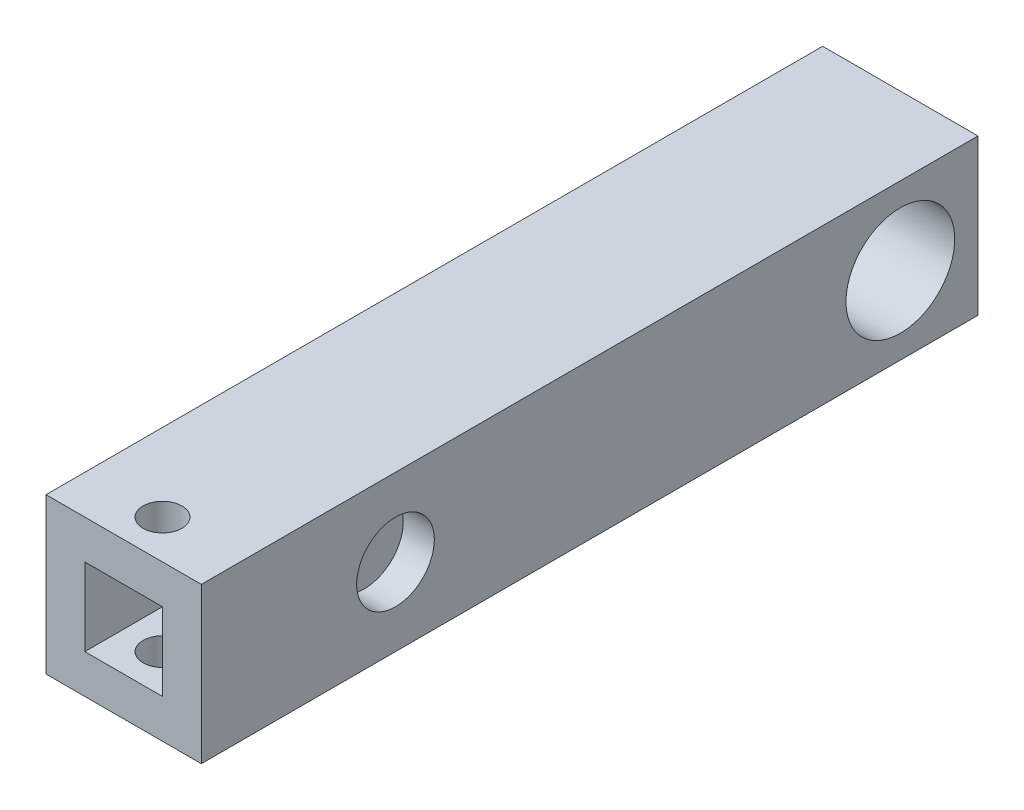
ISO-10303-21;
HEADER;
FILE_DESCRIPTION(('STEP AP214'),'2;1');
FILE_NAME('part.step','',(''),(''),'','','');
FILE_SCHEMA(('AUTOMOTIVE_DESIGN { 1 0 10303 214 1 1 1 1 }'));
ENDSEC;
DATA;
#1=APPLICATION_CONTEXT('core data for automotive mechanical design processes');
#2=APPLICATION_PROTOCOL_DEFINITION('international standard','automotive_design',2000,#1);
#3=PRODUCT_CONTEXT('',#1,'mechanical');
#4=PRODUCT('Part','Part','',(#3));
#5=PRODUCT_RELATED_PRODUCT_CATEGORY('part','',(#4));
#6=PRODUCT_DEFINITION_FORMATION('','',#4);
#7=PRODUCT_DEFINITION_CONTEXT('part definition',#1,'design');
#8=PRODUCT_DEFINITION('design','',#6,#7);
#9=PRODUCT_DEFINITION_SHAPE('','',#8);
#10=(LENGTH_UNIT() NAMED_UNIT(*) SI_UNIT(.MILLI.,.METRE.));
#11=(NAMED_UNIT(*) PLANE_ANGLE_UNIT() SI_UNIT($,.RADIAN.));
#12=(NAMED_UNIT(*) SI_UNIT($,.STERADIAN.) SOLID_ANGLE_UNIT());
#13=UNCERTAINTY_MEASURE_WITH_UNIT(LENGTH_MEASURE(1.E-05),#10,'distance_accuracy_value','');
#14=(GEOMETRIC_REPRESENTATION_CONTEXT(3) GLOBAL_UNCERTAINTY_ASSIGNED_CONTEXT((#13)) GLOBAL_UNIT_ASSIGNED_CONTEXT((#10,
#11,#12)) REPRESENTATION_CONTEXT('',''));
#15=CARTESIAN_POINT('',(0.,0.,0.));
#16=DIRECTION('',(0.,0.,1.));
#17=DIRECTION('',(1.,0.,0.));
#18=AXIS2_PLACEMENT_3D('',#15,#16,#17);
#19=CARTESIAN_POINT('',(100.,-100.,1000.));
#20=DIRECTION('',(-1.,0.,0.));
#21=DIRECTION('',(0.,0.,1.));
#22=AXIS2_PLACEMENT_3D('',#19,#20,#21);
#23=PLANE('',#22);
#24=CARTESIAN_POINT('',(100.,0.,750.));
#25=DIRECTION('',(1.,0.,0.));
#26=DIRECTION('',(0.,0.,-1.));
#27=AXIS2_PLACEMENT_3D('',#24,#25,#26);
#28=CIRCLE('',#27,50.);
#29=CARTESIAN_POINT('',(100.,0.,700.));
#30=VERTEX_POINT('',#29);
#31=EDGE_CURVE('E252',#30,#30,#28,.T.);
#32=ORIENTED_EDGE('',*,*,#31,.F.);
#33=EDGE_LOOP('',(#32));
#34=FACE_BOUND('',#33,.T.);
#35=CARTESIAN_POINT('',(100.,0.,100.));
#36=DIRECTION('',(-1.,0.,0.));
#37=DIRECTION('',(0.,0.,1.));
#38=AXIS2_PLACEMENT_3D('',#35,#36,#37);
#39=CIRCLE('',#38,70.);
#40=CARTESIAN_POINT('',(100.,0.,170.));
#41=VERTEX_POINT('',#40);
#42=EDGE_CURVE('E149',#41,#41,#39,.F.);
#43=ORIENTED_EDGE('',*,*,#42,.F.);
#44=EDGE_LOOP('',(#43));
#45=FACE_BOUND('',#44,.T.);
#46=DIRECTION('',(0.,1.,0.));
#47=VECTOR('',#46,1.);
#48=CARTESIAN_POINT('',(100.,-100.,0.));
#49=LINE('',#48,#47);
#50=CARTESIAN_POINT('',(100.,-100.,0.));
#51=VERTEX_POINT('',#50);
#52=CARTESIAN_POINT('',(100.,100.,0.));
#53=VERTEX_POINT('',#52);
#54=EDGE_CURVE('E152',#51,#53,#49,.T.);
#55=ORIENTED_EDGE('',*,*,#54,.T.);
#56=DIRECTION('',(0.,0.,-1.));
#57=VECTOR('',#56,1.);
#58=CARTESIAN_POINT('',(100.,100.,1000.));
#59=LINE('',#58,#57);
#60=CARTESIAN_POINT('',(100.,100.,1000.));
#61=VERTEX_POINT('',#60);
#62=EDGE_CURVE('E11',#61,#53,#59,.T.);
#63=ORIENTED_EDGE('',*,*,#62,.F.);
#64=DIRECTION('',(0.,1.,0.));
#65=VECTOR('',#64,1.);
#66=CARTESIAN_POINT('',(100.,-100.,1000.));
#67=LINE('',#66,#65);
#68=CARTESIAN_POINT('',(100.,-100.,1000.));
#69=VERTEX_POINT('',#68);
#70=EDGE_CURVE('E153',#69,#61,#67,.T.);
#71=ORIENTED_EDGE('',*,*,#70,.F.);
#72=DIRECTION('',(0.,0.,-1.));
#73=VECTOR('',#72,1.);
#74=CARTESIAN_POINT('',(100.,-100.,1000.));
#75=LINE('',#74,#73);
#76=EDGE_CURVE('E159',#69,#51,#75,.T.);
#77=ORIENTED_EDGE('',*,*,#76,.T.);
#78=EDGE_LOOP('',(#55,#63,#71,#77));
#79=FACE_BOUND('',#78,.T.);
#80=ADVANCED_FACE('F32',(#34,#45,#79),#23,.F.);
#81=CARTESIAN_POINT('',(-100.,100.,1000.));
#82=DIRECTION('',(0.,-1.,0.));
#83=DIRECTION('',(0.,0.,-1.));
#84=AXIS2_PLACEMENT_3D('',#81,#82,#83);
#85=PLANE('',#84);
#86=CARTESIAN_POINT('',(0.,100.,950.));
#87=DIRECTION('',(0.,-1.,0.));
#88=DIRECTION('',(0.,0.,-1.));
#89=AXIS2_PLACEMENT_3D('',#86,#87,#88);
#90=CIRCLE('',#89,25.);
#91=CARTESIAN_POINT('',(25.,100.,950.));
#92=VERTEX_POINT('',#91);
#93=EDGE_CURVE('E133',#92,#92,#90,.F.);
#94=ORIENTED_EDGE('',*,*,#93,.F.);
#95=EDGE_LOOP('',(#94));
#96=FACE_BOUND('',#95,.T.);
#97=DIRECTION('',(-1.,0.,0.));
#98=VECTOR('',#97,1.);
#99=CARTESIAN_POINT('',(-100.,100.,0.));
#100=LINE('',#99,#98);
#101=CARTESIAN_POINT('',(-100.,100.,0.));
#102=VERTEX_POINT('',#101);
#103=EDGE_CURVE('E162',#53,#102,#100,.T.);
#104=ORIENTED_EDGE('',*,*,#103,.T.);
#105=DIRECTION('',(0.,0.,-1.));
#106=VECTOR('',#105,1.);
#107=CARTESIAN_POINT('',(-100.,100.,1000.));
#108=LINE('',#107,#106);
#109=CARTESIAN_POINT('',(-100.,100.,1000.));
#110=VERTEX_POINT('',#109);
#111=EDGE_CURVE('E40',#110,#102,#108,.T.);
#112=ORIENTED_EDGE('',*,*,#111,.F.);
#113=DIRECTION('',(-1.,0.,0.));
#114=VECTOR('',#113,1.);
#115=CARTESIAN_POINT('',(-100.,100.,1000.));
#116=LINE('',#115,#114);
#117=EDGE_CURVE('E85',#61,#110,#116,.T.);
#118=ORIENTED_EDGE('',*,*,#117,.F.);
#119=ORIENTED_EDGE('',*,*,#62,.T.);
#120=EDGE_LOOP('',(#104,#112,#118,#119));
#121=FACE_BOUND('',#120,.T.);
#122=ADVANCED_FACE('F181',(#96,#121),#85,.F.);
#123=CARTESIAN_POINT('',(-100.,-100.,1000.));
#124=DIRECTION('',(1.,0.,0.));
#125=DIRECTION('',(0.,0.,-1.));
#126=AXIS2_PLACEMENT_3D('',#123,#124,#125);
#127=PLANE('',#126);
#128=CARTESIAN_POINT('',(-100.,0.,750.));
#129=DIRECTION('',(-1.,0.,0.));
#130=DIRECTION('',(0.,0.,1.));
#131=AXIS2_PLACEMENT_3D('',#128,#129,#130);
#132=CIRCLE('',#131,50.);
#133=CARTESIAN_POINT('',(-100.,0.,800.));
#134=VERTEX_POINT('',#133);
#135=EDGE_CURVE('E253',#134,#134,#132,.T.);
#136=ORIENTED_EDGE('',*,*,#135,.F.);
#137=EDGE_LOOP('',(#136));
#138=FACE_BOUND('',#137,.T.);
#139=CARTESIAN_POINT('',(-100.,0.,100.));
#140=DIRECTION('',(1.,0.,0.));
#141=DIRECTION('',(0.,0.,-1.));
#142=AXIS2_PLACEMENT_3D('',#139,#140,#141);
#143=CIRCLE('',#142,70.);
#144=CARTESIAN_POINT('',(-100.,0.,30.));
#145=VERTEX_POINT('',#144);
#146=EDGE_CURVE('E145',#145,#145,#143,.F.);
#147=ORIENTED_EDGE('',*,*,#146,.F.);
#148=EDGE_LOOP('',(#147));
#149=FACE_BOUND('',#148,.T.);
#150=DIRECTION('',(0.,-1.,0.));
#151=VECTOR('',#150,1.);
#152=CARTESIAN_POINT('',(-100.,-100.,0.));
#153=LINE('',#152,#151);
#154=CARTESIAN_POINT('',(-100.,-100.,0.));
#155=VERTEX_POINT('',#154);
#156=EDGE_CURVE('E164',#102,#155,#153,.T.);
#157=ORIENTED_EDGE('',*,*,#156,.T.);
#158=DIRECTION('',(0.,0.,-1.));
#159=VECTOR('',#158,1.);
#160=CARTESIAN_POINT('',(-100.,-100.,1000.));
#161=LINE('',#160,#159);
#162=CARTESIAN_POINT('',(-100.,-100.,1000.));
#163=VERTEX_POINT('',#162);
#164=EDGE_CURVE('E168',#163,#155,#161,.T.);
#165=ORIENTED_EDGE('',*,*,#164,.F.);
#166=DIRECTION('',(0.,-1.,0.));
#167=VECTOR('',#166,1.);
#168=CARTESIAN_POINT('',(-100.,-100.,1000.));
#169=LINE('',#168,#167);
#170=EDGE_CURVE('E156',#110,#163,#169,.T.);
#171=ORIENTED_EDGE('',*,*,#170,.F.);
#172=ORIENTED_EDGE('',*,*,#111,.T.);
#173=EDGE_LOOP('',(#157,#165,#171,#172));
#174=FACE_BOUND('',#173,.T.);
#175=ADVANCED_FACE('F177',(#138,#149,#174),#127,.F.);
#176=CARTESIAN_POINT('',(-100.,-100.,1000.));
#177=DIRECTION('',(0.,1.,0.));
#178=DIRECTION('',(0.,0.,1.));
#179=AXIS2_PLACEMENT_3D('',#176,#177,#178);
#180=PLANE('',#179);
#181=CARTESIAN_POINT('',(0.,-100.,950.));
#182=DIRECTION('',(0.,1.,0.));
#183=DIRECTION('',(0.,0.,1.));
#184=AXIS2_PLACEMENT_3D('',#181,#182,#183);
#185=CIRCLE('',#184,25.);
#186=CARTESIAN_POINT('',(25.,-100.,950.));
#187=VERTEX_POINT('',#186);
#188=EDGE_CURVE('E265',#187,#187,#185,.F.);
#189=ORIENTED_EDGE('',*,*,#188,.F.);
#190=EDGE_LOOP('',(#189));
#191=FACE_BOUND('',#190,.T.);
#192=DIRECTION('',(1.,0.,0.));
#193=VECTOR('',#192,1.);
#194=CARTESIAN_POINT('',(-100.,-100.,0.));
#195=LINE('',#194,#193);
#196=EDGE_CURVE('E78',#155,#51,#195,.T.);
#197=ORIENTED_EDGE('',*,*,#196,.T.);
#198=ORIENTED_EDGE('',*,*,#76,.F.);
#199=DIRECTION('',(1.,0.,0.));
#200=VECTOR('',#199,1.);
#201=CARTESIAN_POINT('',(-100.,-100.,1000.));
#202=LINE('',#201,#200);
#203=EDGE_CURVE('E57',#163,#69,#202,.T.);
#204=ORIENTED_EDGE('',*,*,#203,.F.);
#205=ORIENTED_EDGE('',*,*,#164,.T.);
#206=EDGE_LOOP('',(#197,#198,#204,#205));
#207=FACE_BOUND('',#206,.T.);
#208=ADVANCED_FACE('F180',(#191,#207),#180,.F.);
#209=CARTESIAN_POINT('',(0.,0.,1000.));
#210=DIRECTION('',(0.,0.,-1.));
#211=DIRECTION('',(-1.,0.,0.));
#212=AXIS2_PLACEMENT_3D('',#209,#210,#211);
#213=PLANE('',#212);
#214=DIRECTION('',(1.,0.,0.));
#215=VECTOR('',#214,1.);
#216=CARTESIAN_POINT('',(50.,-50.,1000.));
#217=LINE('',#216,#215);
#218=CARTESIAN_POINT('',(-50.,-50.,1000.));
#219=VERTEX_POINT('',#218);
#220=CARTESIAN_POINT('',(50.,-50.,1000.));
#221=VERTEX_POINT('',#220);
#222=EDGE_CURVE('E139',#219,#221,#217,.T.);
#223=ORIENTED_EDGE('',*,*,#222,.F.);
#224=DIRECTION('',(0.,-1.,0.));
#225=VECTOR('',#224,1.);
#226=CARTESIAN_POINT('',(-50.,50.,1000.));
#227=LINE('',#226,#225);
#228=CARTESIAN_POINT('',(-50.,50.,1000.));
#229=VERTEX_POINT('',#228);
#230=EDGE_CURVE('E48',#229,#219,#227,.T.);
#231=ORIENTED_EDGE('',*,*,#230,.F.);
#232=DIRECTION('',(-1.,0.,0.));
#233=VECTOR('',#232,1.);
#234=CARTESIAN_POINT('',(50.,50.,1000.));
#235=LINE('',#234,#233);
#236=CARTESIAN_POINT('',(50.,50.,1000.));
#237=VERTEX_POINT('',#236);
#238=EDGE_CURVE('E127',#237,#229,#235,.T.);
#239=ORIENTED_EDGE('',*,*,#238,.F.);
#240=DIRECTION('',(0.,1.,0.));
#241=VECTOR('',#240,1.);
#242=CARTESIAN_POINT('',(50.,50.,1000.));
#243=LINE('',#242,#241);
#244=EDGE_CURVE('E130',#221,#237,#243,.T.);
#245=ORIENTED_EDGE('',*,*,#244,.F.);
#246=EDGE_LOOP('',(#223,#231,#239,#245));
#247=FACE_BOUND('',#246,.T.);
#248=ORIENTED_EDGE('',*,*,#70,.T.);
#249=ORIENTED_EDGE('',*,*,#117,.T.);
#250=ORIENTED_EDGE('',*,*,#170,.T.);
#251=ORIENTED_EDGE('',*,*,#203,.T.);
#252=EDGE_LOOP('',(#248,#249,#250,#251));
#253=FACE_BOUND('',#252,.T.);
#254=ADVANCED_FACE('F193',(#247,#253),#213,.F.);
#255=CARTESIAN_POINT('',(0.,0.,0.));
#256=DIRECTION('',(0.,0.,-1.));
#257=DIRECTION('',(-1.,0.,0.));
#258=AXIS2_PLACEMENT_3D('',#255,#256,#257);
#259=PLANE('',#258);
#260=ORIENTED_EDGE('',*,*,#54,.F.);
#261=ORIENTED_EDGE('',*,*,#196,.F.);
#262=ORIENTED_EDGE('',*,*,#156,.F.);
#263=ORIENTED_EDGE('',*,*,#103,.F.);
#264=EDGE_LOOP('',(#260,#261,#262,#263));
#265=FACE_BOUND('',#264,.T.);
#266=ADVANCED_FACE('F189',(#265),#259,.T.);
#267=CARTESIAN_POINT('',(200.,0.,100.));
#268=DIRECTION('',(-1.,0.,0.));
#269=DIRECTION('',(0.,0.,1.));
#270=AXIS2_PLACEMENT_3D('',#267,#268,#269);
#271=CYLINDRICAL_SURFACE('',#270,70.);
#272=ORIENTED_EDGE('',*,*,#146,.T.);
#273=EDGE_LOOP('',(#272));
#274=FACE_BOUND('',#273,.T.);
#275=ORIENTED_EDGE('',*,*,#42,.T.);
#276=EDGE_LOOP('',(#275));
#277=FACE_BOUND('',#276,.T.);
#278=ADVANCED_FACE('F174',(#274,#277),#271,.F.);
#279=CARTESIAN_POINT('',(-50.,50.,900.));
#280=DIRECTION('',(-1.,0.,0.));
#281=DIRECTION('',(0.,-1.,0.));
#282=AXIS2_PLACEMENT_3D('',#279,#280,#281);
#283=PLANE('',#282);
#284=ORIENTED_EDGE('',*,*,#230,.T.);
#285=DIRECTION('',(0.,0.,1.));
#286=VECTOR('',#285,1.);
#287=CARTESIAN_POINT('',(-50.,-50.,900.));
#288=LINE('',#287,#286);
#289=CARTESIAN_POINT('',(-50.,-50.,900.));
#290=VERTEX_POINT('',#289);
#291=EDGE_CURVE('E105',#290,#219,#288,.T.);
#292=ORIENTED_EDGE('',*,*,#291,.F.);
#293=DIRECTION('',(0.,-1.,0.));
#294=VECTOR('',#293,1.);
#295=CARTESIAN_POINT('',(-50.,50.,900.));
#296=LINE('',#295,#294);
#297=CARTESIAN_POINT('',(-50.,50.,900.));
#298=VERTEX_POINT('',#297);
#299=EDGE_CURVE('E109',#298,#290,#296,.T.);
#300=ORIENTED_EDGE('',*,*,#299,.F.);
#301=DIRECTION('',(0.,0.,1.));
#302=VECTOR('',#301,1.);
#303=CARTESIAN_POINT('',(-50.,50.,900.));
#304=LINE('',#303,#302);
#305=EDGE_CURVE('E143',#298,#229,#304,.T.);
#306=ORIENTED_EDGE('',*,*,#305,.T.);
#307=EDGE_LOOP('',(#284,#292,#300,#306));
#308=FACE_BOUND('',#307,.T.);
#309=ADVANCED_FACE('F107',(#308),#283,.F.);
#310=CARTESIAN_POINT('',(50.,50.,900.));
#311=DIRECTION('',(0.,1.,0.));
#312=DIRECTION('',(-1.,0.,0.));
#313=AXIS2_PLACEMENT_3D('',#310,#311,#312);
#314=PLANE('',#313);
#315=CARTESIAN_POINT('',(0.,50.,950.));
#316=DIRECTION('',(0.,1.,0.));
#317=DIRECTION('',(-1.,0.,0.));
#318=AXIS2_PLACEMENT_3D('',#315,#316,#317);
#319=CIRCLE('',#318,25.);
#320=CARTESIAN_POINT('',(25.,50.,950.));
#321=VERTEX_POINT('',#320);
#322=EDGE_CURVE('E263',#321,#321,#319,.F.);
#323=ORIENTED_EDGE('',*,*,#322,.F.);
#324=EDGE_LOOP('',(#323));
#325=FACE_BOUND('',#324,.T.);
#326=ORIENTED_EDGE('',*,*,#238,.T.);
#327=ORIENTED_EDGE('',*,*,#305,.F.);
#328=DIRECTION('',(-1.,0.,0.));
#329=VECTOR('',#328,1.);
#330=CARTESIAN_POINT('',(50.,50.,900.));
#331=LINE('',#330,#329);
#332=CARTESIAN_POINT('',(50.,50.,900.));
#333=VERTEX_POINT('',#332);
#334=EDGE_CURVE('E115',#333,#298,#331,.T.);
#335=ORIENTED_EDGE('',*,*,#334,.F.);
#336=DIRECTION('',(0.,0.,1.));
#337=VECTOR('',#336,1.);
#338=CARTESIAN_POINT('',(50.,50.,900.));
#339=LINE('',#338,#337);
#340=EDGE_CURVE('E146',#333,#237,#339,.T.);
#341=ORIENTED_EDGE('',*,*,#340,.T.);
#342=EDGE_LOOP('',(#326,#327,#335,#341));
#343=FACE_BOUND('',#342,.T.);
#344=ADVANCED_FACE('F214',(#325,#343),#314,.F.);
#345=CARTESIAN_POINT('',(50.,50.,900.));
#346=DIRECTION('',(1.,0.,0.));
#347=DIRECTION('',(0.,1.,0.));
#348=AXIS2_PLACEMENT_3D('',#345,#346,#347);
#349=PLANE('',#348);
#350=ORIENTED_EDGE('',*,*,#244,.T.);
#351=ORIENTED_EDGE('',*,*,#340,.F.);
#352=DIRECTION('',(0.,1.,0.));
#353=VECTOR('',#352,1.);
#354=CARTESIAN_POINT('',(50.,50.,900.));
#355=LINE('',#354,#353);
#356=CARTESIAN_POINT('',(50.,-50.,900.));
#357=VERTEX_POINT('',#356);
#358=EDGE_CURVE('E123',#357,#333,#355,.T.);
#359=ORIENTED_EDGE('',*,*,#358,.F.);
#360=DIRECTION('',(0.,0.,1.));
#361=VECTOR('',#360,1.);
#362=CARTESIAN_POINT('',(50.,-50.,900.));
#363=LINE('',#362,#361);
#364=EDGE_CURVE('E114',#357,#221,#363,.T.);
#365=ORIENTED_EDGE('',*,*,#364,.T.);
#366=EDGE_LOOP('',(#350,#351,#359,#365));
#367=FACE_BOUND('',#366,.T.);
#368=ADVANCED_FACE('F217',(#367),#349,.F.);
#369=CARTESIAN_POINT('',(50.,-50.,900.));
#370=DIRECTION('',(0.,-1.,0.));
#371=DIRECTION('',(1.,0.,0.));
#372=AXIS2_PLACEMENT_3D('',#369,#370,#371);
#373=PLANE('',#372);
#374=CARTESIAN_POINT('',(0.,-50.,950.));
#375=DIRECTION('',(0.,-1.,0.));
#376=DIRECTION('',(1.,0.,0.));
#377=AXIS2_PLACEMENT_3D('',#374,#375,#376);
#378=CIRCLE('',#377,25.);
#379=CARTESIAN_POINT('',(25.,-50.,950.));
#380=VERTEX_POINT('',#379);
#381=EDGE_CURVE('E35',#380,#380,#378,.F.);
#382=ORIENTED_EDGE('',*,*,#381,.F.);
#383=EDGE_LOOP('',(#382));
#384=FACE_BOUND('',#383,.T.);
#385=ORIENTED_EDGE('',*,*,#222,.T.);
#386=ORIENTED_EDGE('',*,*,#364,.F.);
#387=DIRECTION('',(1.,0.,0.));
#388=VECTOR('',#387,1.);
#389=CARTESIAN_POINT('',(50.,-50.,900.));
#390=LINE('',#389,#388);
#391=EDGE_CURVE('E118',#290,#357,#390,.T.);
#392=ORIENTED_EDGE('',*,*,#391,.F.);
#393=ORIENTED_EDGE('',*,*,#291,.T.);
#394=EDGE_LOOP('',(#385,#386,#392,#393));
#395=FACE_BOUND('',#394,.T.);
#396=ADVANCED_FACE('F119',(#384,#395),#373,.F.);
#397=CARTESIAN_POINT('',(0.,0.,900.));
#398=DIRECTION('',(0.,0.,-1.));
#399=DIRECTION('',(-1.,0.,0.));
#400=AXIS2_PLACEMENT_3D('',#397,#398,#399);
#401=PLANE('',#400);
#402=ORIENTED_EDGE('',*,*,#299,.T.);
#403=ORIENTED_EDGE('',*,*,#391,.T.);
#404=ORIENTED_EDGE('',*,*,#358,.T.);
#405=ORIENTED_EDGE('',*,*,#334,.T.);
#406=EDGE_LOOP('',(#402,#403,#404,#405));
#407=FACE_BOUND('',#406,.T.);
#408=ADVANCED_FACE('F125',(#407),#401,.F.);
#409=CARTESIAN_POINT('',(0.,133.,950.));
#410=DIRECTION('',(0.,-1.,0.));
#411=DIRECTION('',(1.,0.,0.));
#412=AXIS2_PLACEMENT_3D('',#409,#410,#411);
#413=CYLINDRICAL_SURFACE('',#412,25.);
#414=CARTESIAN_POINT('',(25.,-50.,950.));
#415=CARTESIAN_POINT('',(25.,-50.5208333333333,950.));
#416=CARTESIAN_POINT('',(25.,-51.0416666666667,950.));
#417=CARTESIAN_POINT('',(25.,-52.0833333333333,950.));
#418=CARTESIAN_POINT('',(25.,-52.6041666666666,950.));
#419=CARTESIAN_POINT('',(25.,-53.6458333333333,950.));
#420=CARTESIAN_POINT('',(25.,-54.1666666666667,950.));
#421=CARTESIAN_POINT('',(25.,-55.2083333333333,950.));
#422=CARTESIAN_POINT('',(25.,-55.7291666666667,950.));
#423=CARTESIAN_POINT('',(25.,-56.7708333333333,950.));
#424=CARTESIAN_POINT('',(25.,-57.2916666666667,950.));
#425=CARTESIAN_POINT('',(25.,-58.3333333333333,950.));
#426=CARTESIAN_POINT('',(25.,-58.8541666666667,950.));
#427=CARTESIAN_POINT('',(25.,-59.8958333333333,950.));
#428=CARTESIAN_POINT('',(25.,-60.4166666666666,950.));
#429=CARTESIAN_POINT('',(25.,-61.4583333333333,950.));
#430=CARTESIAN_POINT('',(25.,-61.9791666666667,950.));
#431=CARTESIAN_POINT('',(25.,-63.0208333333333,950.));
#432=CARTESIAN_POINT('',(25.,-63.5416666666667,950.));
#433=CARTESIAN_POINT('',(25.,-64.5833333333333,950.));
#434=CARTESIAN_POINT('',(25.,-65.1041666666667,950.));
#435=CARTESIAN_POINT('',(25.,-66.1458333333333,950.));
#436=CARTESIAN_POINT('',(25.,-66.6666666666667,950.));
#437=CARTESIAN_POINT('',(25.,-67.7083333333333,950.));
#438=CARTESIAN_POINT('',(25.,-68.2291666666666,950.));
#439=CARTESIAN_POINT('',(25.,-69.2708333333333,950.));
#440=CARTESIAN_POINT('',(25.,-69.7916666666667,950.));
#441=CARTESIAN_POINT('',(25.,-70.8333333333333,950.));
#442=CARTESIAN_POINT('',(25.,-71.3541666666667,950.));
#443=CARTESIAN_POINT('',(25.,-72.3958333333333,950.));
#444=CARTESIAN_POINT('',(25.,-72.9166666666667,950.));
#445=CARTESIAN_POINT('',(25.,-73.9583333333333,950.));
#446=CARTESIAN_POINT('',(25.,-74.4791666666667,950.));
#447=CARTESIAN_POINT('',(25.,-75.5208333333333,950.));
#448=CARTESIAN_POINT('',(25.,-76.0416666666666,950.));
#449=CARTESIAN_POINT('',(25.,-77.0833333333333,950.));
#450=CARTESIAN_POINT('',(25.,-77.6041666666666,950.));
#451=CARTESIAN_POINT('',(25.,-78.6458333333333,950.));
#452=CARTESIAN_POINT('',(25.,-79.1666666666666,950.));
#453=CARTESIAN_POINT('',(25.,-80.2083333333333,950.));
#454=CARTESIAN_POINT('',(25.,-80.7291666666666,950.));
#455=CARTESIAN_POINT('',(25.,-81.7708333333333,950.));
#456=CARTESIAN_POINT('',(25.,-82.2916666666667,950.));
#457=CARTESIAN_POINT('',(25.,-83.3333333333333,950.));
#458=CARTESIAN_POINT('',(25.,-83.8541666666666,950.));
#459=CARTESIAN_POINT('',(25.,-84.8958333333333,950.));
#460=CARTESIAN_POINT('',(25.,-85.4166666666666,950.));
#461=CARTESIAN_POINT('',(25.,-86.4583333333333,950.));
#462=CARTESIAN_POINT('',(25.,-86.9791666666666,950.));
#463=CARTESIAN_POINT('',(25.,-88.0208333333333,950.));
#464=CARTESIAN_POINT('',(25.,-88.5416666666666,950.));
#465=CARTESIAN_POINT('',(25.,-89.5833333333333,950.));
#466=CARTESIAN_POINT('',(25.,-90.1041666666667,950.));
#467=CARTESIAN_POINT('',(25.,-91.1458333333333,950.));
#468=CARTESIAN_POINT('',(25.,-91.6666666666666,950.));
#469=CARTESIAN_POINT('',(25.,-92.7083333333333,950.));
#470=CARTESIAN_POINT('',(25.,-93.2291666666666,950.));
#471=CARTESIAN_POINT('',(25.,-94.2708333333333,950.));
#472=CARTESIAN_POINT('',(25.,-94.7916666666666,950.));
#473=CARTESIAN_POINT('',(25.,-95.8333333333333,950.));
#474=CARTESIAN_POINT('',(25.,-96.3541666666666,950.));
#475=CARTESIAN_POINT('',(25.,-97.3958333333333,950.));
#476=CARTESIAN_POINT('',(25.,-97.9166666666667,950.));
#477=CARTESIAN_POINT('',(25.,-98.9583333333333,950.));
#478=CARTESIAN_POINT('',(25.,-99.4791666666666,950.));
#479=CARTESIAN_POINT('',(25.,-100.,950.));
#480=B_SPLINE_CURVE_WITH_KNOTS('',3,(#414,#415,#416,#417,#418,#419,#420,#421,#422,#423,#424,
#425,#426,#427,#428,#429,#430,#431,#432,#433,#434,#435,#436,#437,#438,#439,#440,#441,#442,#443,
#444,#445,#446,#447,#448,#449,#450,#451,#452,#453,#454,#455,#456,#457,#458,#459,#460,#461,#462,
#463,#464,#465,#466,#467,#468,#469,#470,#471,#472,#473,#474,#475,#476,#477,#478,#479),
.UNSPECIFIED.,.F.,.F.,(4,2,2,2,2,2,2,2,2,2,2,2,2,2,2,2,2,2,2,2,2,2,2,2,2,2,2,2,2,2,2,2,4),(0.,
1.56249999999999,3.12499999999999,4.68750000000001,6.25000000000001,7.8125,9.37499999999999,
10.9375,12.5,14.0625,15.625,17.1875,18.75,20.3125,21.875,23.4375,25.,26.5625,28.125,29.6875,
31.25,32.8125,34.375,35.9375,37.5,39.0625,40.625,42.1875,43.75,45.3125,46.875,48.4375,50.),.UNSPECIFIED.);
#481=EDGE_CURVE('BSEAM227',#380,#187,#480,.T.);
#482=ORIENTED_EDGE('',*,*,#381,.T.);
#483=ORIENTED_EDGE('',*,*,#188,.T.);
#484=ORIENTED_EDGE('',*,*,#481,.T.);
#485=ORIENTED_EDGE('',*,*,#481,.F.);
#486=EDGE_LOOP('',(#482,#484,#483,#485));
#487=FACE_BOUND('',#486,.T.);
#488=ADVANCED_FACE('F227',(#487),#413,.F.);
#489=CARTESIAN_POINT('',(25.,50.,950.));
#490=CARTESIAN_POINT('',(25.,50.5208333333333,950.));
#491=CARTESIAN_POINT('',(25.,51.0416666666667,950.));
#492=CARTESIAN_POINT('',(25.,52.0833333333333,950.));
#493=CARTESIAN_POINT('',(25.,52.6041666666667,950.));
#494=CARTESIAN_POINT('',(25.,53.6458333333333,950.));
#495=CARTESIAN_POINT('',(25.,54.1666666666667,950.));
#496=CARTESIAN_POINT('',(25.,55.2083333333333,950.));
#497=CARTESIAN_POINT('',(25.,55.7291666666667,950.));
#498=CARTESIAN_POINT('',(25.,56.7708333333333,950.));
#499=CARTESIAN_POINT('',(25.,57.2916666666667,950.));
#500=CARTESIAN_POINT('',(25.,58.3333333333333,950.));
#501=CARTESIAN_POINT('',(25.,58.8541666666667,950.));
#502=CARTESIAN_POINT('',(25.,59.8958333333333,950.));
#503=CARTESIAN_POINT('',(25.,60.4166666666667,950.));
#504=CARTESIAN_POINT('',(25.,61.4583333333333,950.));
#505=CARTESIAN_POINT('',(25.,61.9791666666667,950.));
#506=CARTESIAN_POINT('',(25.,63.0208333333333,950.));
#507=CARTESIAN_POINT('',(25.,63.5416666666667,950.));
#508=CARTESIAN_POINT('',(25.,64.5833333333333,950.));
#509=CARTESIAN_POINT('',(25.,65.1041666666667,950.));
#510=CARTESIAN_POINT('',(25.,66.1458333333333,950.));
#511=CARTESIAN_POINT('',(25.,66.6666666666667,950.));
#512=CARTESIAN_POINT('',(25.,67.7083333333333,950.));
#513=CARTESIAN_POINT('',(25.,68.2291666666667,950.));
#514=CARTESIAN_POINT('',(25.,69.2708333333333,950.));
#515=CARTESIAN_POINT('',(25.,69.7916666666667,950.));
#516=CARTESIAN_POINT('',(25.,70.8333333333333,950.));
#517=CARTESIAN_POINT('',(25.,71.3541666666667,950.));
#518=CARTESIAN_POINT('',(25.,72.3958333333333,950.));
#519=CARTESIAN_POINT('',(25.,72.9166666666667,950.));
#520=CARTESIAN_POINT('',(25.,73.9583333333333,950.));
#521=CARTESIAN_POINT('',(25.,74.4791666666667,950.));
#522=CARTESIAN_POINT('',(25.,75.5208333333333,950.));
#523=CARTESIAN_POINT('',(25.,76.0416666666667,950.));
#524=CARTESIAN_POINT('',(25.,77.0833333333333,950.));
#525=CARTESIAN_POINT('',(25.,77.6041666666667,950.));
#526=CARTESIAN_POINT('',(25.,78.6458333333333,950.));
#527=CARTESIAN_POINT('',(25.,79.1666666666667,950.));
#528=CARTESIAN_POINT('',(25.,80.2083333333333,950.));
#529=CARTESIAN_POINT('',(25.,80.7291666666667,950.));
#530=CARTESIAN_POINT('',(25.,81.7708333333333,950.));
#531=CARTESIAN_POINT('',(25.,82.2916666666667,950.));
#532=CARTESIAN_POINT('',(25.,83.3333333333333,950.));
#533=CARTESIAN_POINT('',(25.,83.8541666666667,950.));
#534=CARTESIAN_POINT('',(25.,84.8958333333333,950.));
#535=CARTESIAN_POINT('',(25.,85.4166666666667,950.));
#536=CARTESIAN_POINT('',(25.,86.4583333333333,950.));
#537=CARTESIAN_POINT('',(25.,86.9791666666667,950.));
#538=CARTESIAN_POINT('',(25.,88.0208333333333,950.));
#539=CARTESIAN_POINT('',(25.,88.5416666666667,950.));
#540=CARTESIAN_POINT('',(25.,89.5833333333333,950.));
#541=CARTESIAN_POINT('',(25.,90.1041666666667,950.));
#542=CARTESIAN_POINT('',(25.,91.1458333333333,950.));
#543=CARTESIAN_POINT('',(25.,91.6666666666667,950.));
#544=CARTESIAN_POINT('',(25.,92.7083333333333,950.));
#545=CARTESIAN_POINT('',(25.,93.2291666666667,950.));
#546=CARTESIAN_POINT('',(25.,94.2708333333333,950.));
#547=CARTESIAN_POINT('',(25.,94.7916666666667,950.));
#548=CARTESIAN_POINT('',(25.,95.8333333333333,950.));
#549=CARTESIAN_POINT('',(25.,96.3541666666667,950.));
#550=CARTESIAN_POINT('',(25.,97.3958333333333,950.));
#551=CARTESIAN_POINT('',(25.,97.9166666666667,950.));
#552=CARTESIAN_POINT('',(25.,98.9583333333333,950.));
#553=CARTESIAN_POINT('',(25.,99.4791666666667,950.));
#554=CARTESIAN_POINT('',(25.,100.,950.));
#555=B_SPLINE_CURVE_WITH_KNOTS('',3,(#489,#490,#491,#492,#493,#494,#495,#496,#497,#498,#499,
#500,#501,#502,#503,#504,#505,#506,#507,#508,#509,#510,#511,#512,#513,#514,#515,#516,#517,#518,
#519,#520,#521,#522,#523,#524,#525,#526,#527,#528,#529,#530,#531,#532,#533,#534,#535,#536,#537,
#538,#539,#540,#541,#542,#543,#544,#545,#546,#547,#548,#549,#550,#551,#552,#553,#554),
.UNSPECIFIED.,.F.,.F.,(4,2,2,2,2,2,2,2,2,2,2,2,2,2,2,2,2,2,2,2,2,2,2,2,2,2,2,2,2,2,2,2,4),(0.,
1.56249999999999,3.125,4.6875,6.25000000000001,7.8125,9.37500000000001,10.9375,12.5,14.0625,
15.625,17.1875,18.75,20.3125,21.875,23.4375,25.,26.5625,28.125,29.6875,31.25,32.8125,34.375,
35.9375,37.5,39.0625,40.625,42.1875,43.75,45.3125,46.875,48.4375,50.),.UNSPECIFIED.);
#556=EDGE_CURVE('BSEAM228',#321,#92,#555,.T.);
#557=ORIENTED_EDGE('',*,*,#322,.T.);
#558=ORIENTED_EDGE('',*,*,#93,.T.);
#559=ORIENTED_EDGE('',*,*,#556,.T.);
#560=ORIENTED_EDGE('',*,*,#556,.F.);
#561=EDGE_LOOP('',(#557,#559,#558,#560));
#562=FACE_BOUND('',#561,.T.);
#563=ADVANCED_FACE('F228',(#562),#413,.F.);
#564=CARTESIAN_POINT('',(60.,0.,750.));
#565=DIRECTION('',(1.,0.,0.));
#566=DIRECTION('',(0.,0.,-1.));
#567=AXIS2_PLACEMENT_3D('',#564,#565,#566);
#568=CYLINDRICAL_SURFACE('',#567,50.);
#569=CARTESIAN_POINT('',(60.,0.,750.));
#570=DIRECTION('',(1.,0.,0.));
#571=DIRECTION('',(0.,0.,-1.));
#572=AXIS2_PLACEMENT_3D('',#569,#570,#571);
#573=CIRCLE('',#572,50.);
#574=CARTESIAN_POINT('',(60.,0.,700.));
#575=VERTEX_POINT('',#574);
#576=EDGE_CURVE('E256',#575,#575,#573,.T.);
#577=ORIENTED_EDGE('',*,*,#576,.F.);
#578=EDGE_LOOP('',(#577));
#579=FACE_BOUND('',#578,.T.);
#580=ORIENTED_EDGE('',*,*,#31,.T.);
#581=EDGE_LOOP('',(#580));
#582=FACE_BOUND('',#581,.T.);
#583=ADVANCED_FACE('F231',(#579,#582),#568,.F.);
#584=CARTESIAN_POINT('',(60.,0.,750.));
#585=DIRECTION('',(1.,0.,0.));
#586=DIRECTION('',(0.,0.,-1.));
#587=AXIS2_PLACEMENT_3D('',#584,#585,#586);
#588=PLANE('',#587);
#589=ORIENTED_EDGE('',*,*,#576,.T.);
#590=EDGE_LOOP('',(#589));
#591=FACE_BOUND('',#590,.T.);
#592=ADVANCED_FACE('F235',(#591),#588,.T.);
#593=CARTESIAN_POINT('',(-60.,0.,750.));
#594=DIRECTION('',(-1.,0.,0.));
#595=DIRECTION('',(0.,0.,1.));
#596=AXIS2_PLACEMENT_3D('',#593,#594,#595);
#597=CYLINDRICAL_SURFACE('',#596,50.);
#598=CARTESIAN_POINT('',(-60.,0.,750.));
#599=DIRECTION('',(-1.,0.,0.));
#600=DIRECTION('',(0.,0.,1.));
#601=AXIS2_PLACEMENT_3D('',#598,#599,#600);
#602=CIRCLE('',#601,50.);
#603=CARTESIAN_POINT('',(-60.,0.,800.));
#604=VERTEX_POINT('',#603);
#605=EDGE_CURVE('E251',#604,#604,#602,.T.);
#606=ORIENTED_EDGE('',*,*,#605,.F.);
#607=EDGE_LOOP('',(#606));
#608=FACE_BOUND('',#607,.T.);
#609=ORIENTED_EDGE('',*,*,#135,.T.);
#610=EDGE_LOOP('',(#609));
#611=FACE_BOUND('',#610,.T.);
#612=ADVANCED_FACE('F239',(#608,#611),#597,.F.);
#613=CARTESIAN_POINT('',(-60.,0.,750.));
#614=DIRECTION('',(-1.,0.,0.));
#615=DIRECTION('',(0.,0.,1.));
#616=AXIS2_PLACEMENT_3D('',#613,#614,#615);
#617=PLANE('',#616);
#618=ORIENTED_EDGE('',*,*,#605,.T.);
#619=EDGE_LOOP('',(#618));
#620=FACE_BOUND('',#619,.T.);
#621=ADVANCED_FACE('F243',(#620),#617,.T.);
#622=CLOSED_SHELL('',(#80,#122,#175,#208,#254,#266,#278,#309,#344,#368,#396,#408,#488,#563,#583,
#592,#612,#621));
#623=MANIFOLD_SOLID_BREP('B2',#622);
#624=ADVANCED_BREP_SHAPE_REPRESENTATION('',(#18,#623),#14);
#625=SHAPE_DEFINITION_REPRESENTATION(#9,#624);
ENDSEC;
END-ISO-10303-21;
